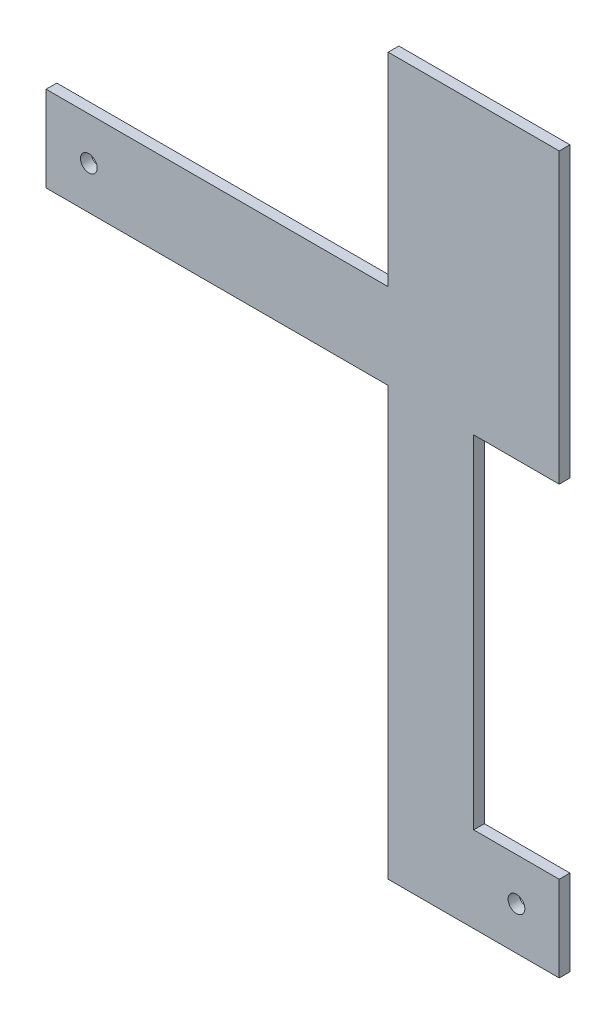
ISO-10303-21;
HEADER;
FILE_DESCRIPTION(('STEP AP214'),'2;1');
FILE_NAME('part.step','',(''),(''),'','','');
FILE_SCHEMA(('AUTOMOTIVE_DESIGN { 1 0 10303 214 1 1 1 1 }'));
ENDSEC;
DATA;
#1=APPLICATION_CONTEXT('core data for automotive mechanical design processes');
#2=APPLICATION_PROTOCOL_DEFINITION('international standard','automotive_design',2000,#1);
#3=PRODUCT_CONTEXT('',#1,'mechanical');
#4=PRODUCT('Part','Part','',(#3));
#5=PRODUCT_RELATED_PRODUCT_CATEGORY('part','',(#4));
#6=PRODUCT_DEFINITION_FORMATION('','',#4);
#7=PRODUCT_DEFINITION_CONTEXT('part definition',#1,'design');
#8=PRODUCT_DEFINITION('design','',#6,#7);
#9=PRODUCT_DEFINITION_SHAPE('','',#8);
#10=(LENGTH_UNIT() NAMED_UNIT(*) SI_UNIT(.MILLI.,.METRE.));
#11=(NAMED_UNIT(*) PLANE_ANGLE_UNIT() SI_UNIT($,.RADIAN.));
#12=(NAMED_UNIT(*) SI_UNIT($,.STERADIAN.) SOLID_ANGLE_UNIT());
#13=UNCERTAINTY_MEASURE_WITH_UNIT(LENGTH_MEASURE(1.E-05),#10,'distance_accuracy_value','');
#14=(GEOMETRIC_REPRESENTATION_CONTEXT(3) GLOBAL_UNCERTAINTY_ASSIGNED_CONTEXT((#13)) GLOBAL_UNIT_ASSIGNED_CONTEXT((#10,
#11,#12)) REPRESENTATION_CONTEXT('',''));
#15=CARTESIAN_POINT('',(0.,0.,0.));
#16=DIRECTION('',(0.,0.,1.));
#17=DIRECTION('',(1.,0.,0.));
#18=AXIS2_PLACEMENT_3D('',#15,#16,#17);
#19=CARTESIAN_POINT('',(-12.7,106.3625,3.175));
#20=DIRECTION('',(1.,0.,0.));
#21=DIRECTION('',(0.,1.,0.));
#22=AXIS2_PLACEMENT_3D('',#19,#20,#21);
#23=PLANE('',#22);
#24=DIRECTION('',(0.,-1.,0.));
#25=VECTOR('',#24,1.);
#26=CARTESIAN_POINT('',(-12.7,106.3625,0.));
#27=LINE('',#26,#25);
#28=CARTESIAN_POINT('',(-12.7,106.3625,0.));
#29=VERTEX_POINT('',#28);
#30=CARTESIAN_POINT('',(-12.7,46.0374999999999,0.));
#31=VERTEX_POINT('',#30);
#32=EDGE_CURVE('E170',#29,#31,#27,.T.);
#33=ORIENTED_EDGE('',*,*,#32,.T.);
#34=DIRECTION('',(0.,0.,-1.));
#35=VECTOR('',#34,1.);
#36=CARTESIAN_POINT('',(-12.7,46.0374999999999,3.175));
#37=LINE('',#36,#35);
#38=CARTESIAN_POINT('',(-12.7,46.0374999999999,3.175));
#39=VERTEX_POINT('',#38);
#40=EDGE_CURVE('E11',#39,#31,#37,.T.);
#41=ORIENTED_EDGE('',*,*,#40,.F.);
#42=DIRECTION('',(0.,-1.,0.));
#43=VECTOR('',#42,1.);
#44=CARTESIAN_POINT('',(-12.7,106.3625,3.175));
#45=LINE('',#44,#43);
#46=CARTESIAN_POINT('',(-12.7,106.3625,3.175));
#47=VERTEX_POINT('',#46);
#48=EDGE_CURVE('E205',#47,#39,#45,.T.);
#49=ORIENTED_EDGE('',*,*,#48,.F.);
#50=DIRECTION('',(0.,0.,-1.));
#51=VECTOR('',#50,1.);
#52=CARTESIAN_POINT('',(-12.7,106.3625,3.175));
#53=LINE('',#52,#51);
#54=EDGE_CURVE('E166',#47,#29,#53,.T.);
#55=ORIENTED_EDGE('',*,*,#54,.T.);
#56=EDGE_LOOP('',(#33,#41,#49,#55));
#57=FACE_BOUND('',#56,.T.);
#58=ADVANCED_FACE('F45',(#57),#23,.F.);
#59=CARTESIAN_POINT('',(-12.7,46.0374999999999,3.175));
#60=DIRECTION('',(0.,-1.,0.));
#61=DIRECTION('',(1.,0.,0.));
#62=AXIS2_PLACEMENT_3D('',#59,#60,#61);
#63=PLANE('',#62);
#64=DIRECTION('',(-1.,0.,0.));
#65=VECTOR('',#64,1.);
#66=CARTESIAN_POINT('',(-12.7,46.0374999999999,0.));
#67=LINE('',#66,#65);
#68=CARTESIAN_POINT('',(-114.3,46.0374999999999,0.));
#69=VERTEX_POINT('',#68);
#70=EDGE_CURVE('E174',#31,#69,#67,.T.);
#71=ORIENTED_EDGE('',*,*,#70,.T.);
#72=DIRECTION('',(0.,0.,-1.));
#73=VECTOR('',#72,1.);
#74=CARTESIAN_POINT('',(-114.3,46.0374999999999,3.175));
#75=LINE('',#74,#73);
#76=CARTESIAN_POINT('',(-114.3,46.0374999999999,3.175));
#77=VERTEX_POINT('',#76);
#78=EDGE_CURVE('E54',#77,#69,#75,.T.);
#79=ORIENTED_EDGE('',*,*,#78,.F.);
#80=DIRECTION('',(-1.,0.,0.));
#81=VECTOR('',#80,1.);
#82=CARTESIAN_POINT('',(-12.7,46.0374999999999,3.175));
#83=LINE('',#82,#81);
#84=EDGE_CURVE('E117',#39,#77,#83,.T.);
#85=ORIENTED_EDGE('',*,*,#84,.F.);
#86=ORIENTED_EDGE('',*,*,#40,.T.);
#87=EDGE_LOOP('',(#71,#79,#85,#86));
#88=FACE_BOUND('',#87,.T.);
#89=ADVANCED_FACE('F300',(#88),#63,.F.);
#90=CARTESIAN_POINT('',(-114.3,46.0374999999999,3.175));
#91=DIRECTION('',(1.,0.,0.));
#92=DIRECTION('',(0.,0.,-1.));
#93=AXIS2_PLACEMENT_3D('',#90,#91,#92);
#94=PLANE('',#93);
#95=DIRECTION('',(0.,-1.,0.));
#96=VECTOR('',#95,1.);
#97=CARTESIAN_POINT('',(-114.3,46.0374999999999,0.));
#98=LINE('',#97,#96);
#99=CARTESIAN_POINT('',(-114.3,20.6374999999999,0.));
#100=VERTEX_POINT('',#99);
#101=EDGE_CURVE('E178',#69,#100,#98,.T.);
#102=ORIENTED_EDGE('',*,*,#101,.T.);
#103=DIRECTION('',(0.,0.,-1.));
#104=VECTOR('',#103,1.);
#105=CARTESIAN_POINT('',(-114.3,20.6374999999999,3.175));
#106=LINE('',#105,#104);
#107=CARTESIAN_POINT('',(-114.3,20.6374999999999,3.175));
#108=VERTEX_POINT('',#107);
#109=EDGE_CURVE('E232',#108,#100,#106,.T.);
#110=ORIENTED_EDGE('',*,*,#109,.F.);
#111=DIRECTION('',(0.,-1.,0.));
#112=VECTOR('',#111,1.);
#113=CARTESIAN_POINT('',(-114.3,46.0374999999999,3.175));
#114=LINE('',#113,#112);
#115=EDGE_CURVE('E242',#77,#108,#114,.T.);
#116=ORIENTED_EDGE('',*,*,#115,.F.);
#117=ORIENTED_EDGE('',*,*,#78,.T.);
#118=EDGE_LOOP('',(#102,#110,#116,#117));
#119=FACE_BOUND('',#118,.T.);
#120=ADVANCED_FACE('F240',(#119),#94,.F.);
#121=CARTESIAN_POINT('',(-114.3,20.6374999999999,3.175));
#122=DIRECTION('',(0.,1.,0.));
#123=DIRECTION('',(-1.,0.,0.));
#124=AXIS2_PLACEMENT_3D('',#121,#122,#123);
#125=PLANE('',#124);
#126=DIRECTION('',(1.,0.,0.));
#127=VECTOR('',#126,1.);
#128=CARTESIAN_POINT('',(-114.3,20.6374999999999,0.));
#129=LINE('',#128,#127);
#130=CARTESIAN_POINT('',(-12.7,20.6374999999999,0.));
#131=VERTEX_POINT('',#130);
#132=EDGE_CURVE('E181',#100,#131,#129,.T.);
#133=ORIENTED_EDGE('',*,*,#132,.T.);
#134=DIRECTION('',(0.,0.,-1.));
#135=VECTOR('',#134,1.);
#136=CARTESIAN_POINT('',(-12.7,20.6374999999999,3.175));
#137=LINE('',#136,#135);
#138=CARTESIAN_POINT('',(-12.7,20.6374999999999,3.175));
#139=VERTEX_POINT('',#138);
#140=EDGE_CURVE('E228',#139,#131,#137,.T.);
#141=ORIENTED_EDGE('',*,*,#140,.F.);
#142=DIRECTION('',(1.,0.,0.));
#143=VECTOR('',#142,1.);
#144=CARTESIAN_POINT('',(-114.3,20.6374999999999,3.175));
#145=LINE('',#144,#143);
#146=EDGE_CURVE('E261',#108,#139,#145,.T.);
#147=ORIENTED_EDGE('',*,*,#146,.F.);
#148=ORIENTED_EDGE('',*,*,#109,.T.);
#149=EDGE_LOOP('',(#133,#141,#147,#148));
#150=FACE_BOUND('',#149,.T.);
#151=ADVANCED_FACE('F251',(#150),#125,.F.);
#152=CARTESIAN_POINT('',(-12.7,20.6374999999999,3.175));
#153=DIRECTION('',(1.,0.,0.));
#154=DIRECTION('',(0.,1.,0.));
#155=AXIS2_PLACEMENT_3D('',#152,#153,#154);
#156=PLANE('',#155);
#157=DIRECTION('',(0.,-1.,0.));
#158=VECTOR('',#157,1.);
#159=CARTESIAN_POINT('',(-12.7,20.6374999999999,0.));
#160=LINE('',#159,#158);
#161=CARTESIAN_POINT('',(-12.7,-106.3625,0.));
#162=VERTEX_POINT('',#161);
#163=EDGE_CURVE('E184',#131,#162,#160,.T.);
#164=ORIENTED_EDGE('',*,*,#163,.T.);
#165=DIRECTION('',(0.,0.,-1.));
#166=VECTOR('',#165,1.);
#167=CARTESIAN_POINT('',(-12.7,-106.3625,3.175));
#168=LINE('',#167,#166);
#169=CARTESIAN_POINT('',(-12.7,-106.3625,3.175));
#170=VERTEX_POINT('',#169);
#171=EDGE_CURVE('E224',#170,#162,#168,.T.);
#172=ORIENTED_EDGE('',*,*,#171,.F.);
#173=DIRECTION('',(0.,-1.,0.));
#174=VECTOR('',#173,1.);
#175=CARTESIAN_POINT('',(-12.7,20.6374999999999,3.175));
#176=LINE('',#175,#174);
#177=EDGE_CURVE('E257',#139,#170,#176,.T.);
#178=ORIENTED_EDGE('',*,*,#177,.F.);
#179=ORIENTED_EDGE('',*,*,#140,.T.);
#180=EDGE_LOOP('',(#164,#172,#178,#179));
#181=FACE_BOUND('',#180,.T.);
#182=ADVANCED_FACE('F255',(#181),#156,.F.);
#183=CARTESIAN_POINT('',(38.1,-106.3625,3.175));
#184=DIRECTION('',(0.,1.,0.));
#185=DIRECTION('',(0.,0.,1.));
#186=AXIS2_PLACEMENT_3D('',#183,#184,#185);
#187=PLANE('',#186);
#188=DIRECTION('',(1.,0.,0.));
#189=VECTOR('',#188,1.);
#190=CARTESIAN_POINT('',(38.1,-106.3625,0.));
#191=LINE('',#190,#189);
#192=CARTESIAN_POINT('',(38.1,-106.3625,0.));
#193=VERTEX_POINT('',#192);
#194=EDGE_CURVE('E187',#162,#193,#191,.T.);
#195=ORIENTED_EDGE('',*,*,#194,.T.);
#196=DIRECTION('',(0.,0.,-1.));
#197=VECTOR('',#196,1.);
#198=CARTESIAN_POINT('',(38.1,-106.3625,3.175));
#199=LINE('',#198,#197);
#200=CARTESIAN_POINT('',(38.1,-106.3625,3.175));
#201=VERTEX_POINT('',#200);
#202=EDGE_CURVE('E220',#201,#193,#199,.T.);
#203=ORIENTED_EDGE('',*,*,#202,.F.);
#204=DIRECTION('',(1.,0.,0.));
#205=VECTOR('',#204,1.);
#206=CARTESIAN_POINT('',(38.1,-106.3625,3.175));
#207=LINE('',#206,#205);
#208=EDGE_CURVE('E260',#170,#201,#207,.T.);
#209=ORIENTED_EDGE('',*,*,#208,.F.);
#210=ORIENTED_EDGE('',*,*,#171,.T.);
#211=EDGE_LOOP('',(#195,#203,#209,#210));
#212=FACE_BOUND('',#211,.T.);
#213=ADVANCED_FACE('F313',(#212),#187,.F.);
#214=CARTESIAN_POINT('',(38.1,-80.9625000000001,3.175));
#215=DIRECTION('',(-1.,0.,0.));
#216=DIRECTION('',(0.,0.,1.));
#217=AXIS2_PLACEMENT_3D('',#214,#215,#216);
#218=PLANE('',#217);
#219=DIRECTION('',(0.,1.,0.));
#220=VECTOR('',#219,1.);
#221=CARTESIAN_POINT('',(38.1,-80.9625000000001,0.));
#222=LINE('',#221,#220);
#223=CARTESIAN_POINT('',(38.1,-80.9625000000001,0.));
#224=VERTEX_POINT('',#223);
#225=EDGE_CURVE('E190',#193,#224,#222,.T.);
#226=ORIENTED_EDGE('',*,*,#225,.T.);
#227=DIRECTION('',(0.,0.,-1.));
#228=VECTOR('',#227,1.);
#229=CARTESIAN_POINT('',(38.1,-80.9625000000001,3.175));
#230=LINE('',#229,#228);
#231=CARTESIAN_POINT('',(38.1,-80.9625000000001,3.175));
#232=VERTEX_POINT('',#231);
#233=EDGE_CURVE('E216',#232,#224,#230,.T.);
#234=ORIENTED_EDGE('',*,*,#233,.F.);
#235=DIRECTION('',(0.,1.,0.));
#236=VECTOR('',#235,1.);
#237=CARTESIAN_POINT('',(38.1,-80.9625000000001,3.175));
#238=LINE('',#237,#236);
#239=EDGE_CURVE('E265',#201,#232,#238,.T.);
#240=ORIENTED_EDGE('',*,*,#239,.F.);
#241=ORIENTED_EDGE('',*,*,#202,.T.);
#242=EDGE_LOOP('',(#226,#234,#240,#241));
#243=FACE_BOUND('',#242,.T.);
#244=ADVANCED_FACE('F316',(#243),#218,.F.);
#245=CARTESIAN_POINT('',(12.7,-80.9625000000001,3.175));
#246=DIRECTION('',(0.,-1.,0.));
#247=DIRECTION('',(0.,0.,-1.));
#248=AXIS2_PLACEMENT_3D('',#245,#246,#247);
#249=PLANE('',#248);
#250=DIRECTION('',(-1.,0.,0.));
#251=VECTOR('',#250,1.);
#252=CARTESIAN_POINT('',(12.7,-80.9625000000001,0.));
#253=LINE('',#252,#251);
#254=CARTESIAN_POINT('',(12.7,-80.9625000000001,0.));
#255=VERTEX_POINT('',#254);
#256=EDGE_CURVE('E193',#224,#255,#253,.T.);
#257=ORIENTED_EDGE('',*,*,#256,.T.);
#258=DIRECTION('',(0.,0.,-1.));
#259=VECTOR('',#258,1.);
#260=CARTESIAN_POINT('',(12.7,-80.9625000000001,3.175));
#261=LINE('',#260,#259);
#262=CARTESIAN_POINT('',(12.7,-80.9625000000001,3.175));
#263=VERTEX_POINT('',#262);
#264=EDGE_CURVE('E212',#263,#255,#261,.T.);
#265=ORIENTED_EDGE('',*,*,#264,.F.);
#266=DIRECTION('',(-1.,0.,0.));
#267=VECTOR('',#266,1.);
#268=CARTESIAN_POINT('',(12.7,-80.9625000000001,3.175));
#269=LINE('',#268,#267);
#270=EDGE_CURVE('E272',#232,#263,#269,.T.);
#271=ORIENTED_EDGE('',*,*,#270,.F.);
#272=ORIENTED_EDGE('',*,*,#233,.T.);
#273=EDGE_LOOP('',(#257,#265,#271,#272));
#274=FACE_BOUND('',#273,.T.);
#275=ADVANCED_FACE('F280',(#274),#249,.F.);
#276=CARTESIAN_POINT('',(12.7,-80.9625000000001,3.175));
#277=DIRECTION('',(-1.,0.,0.));
#278=DIRECTION('',(0.,-1.,0.));
#279=AXIS2_PLACEMENT_3D('',#276,#277,#278);
#280=PLANE('',#279);
#281=DIRECTION('',(0.,1.,0.));
#282=VECTOR('',#281,1.);
#283=CARTESIAN_POINT('',(12.7,-80.9625000000001,0.));
#284=LINE('',#283,#282);
#285=CARTESIAN_POINT('',(12.7,20.6374999999999,0.));
#286=VERTEX_POINT('',#285);
#287=EDGE_CURVE('E196',#255,#286,#284,.T.);
#288=ORIENTED_EDGE('',*,*,#287,.T.);
#289=DIRECTION('',(0.,0.,-1.));
#290=VECTOR('',#289,1.);
#291=CARTESIAN_POINT('',(12.7,20.6374999999999,3.175));
#292=LINE('',#291,#290);
#293=CARTESIAN_POINT('',(12.7,20.6374999999999,3.175));
#294=VERTEX_POINT('',#293);
#295=EDGE_CURVE('E159',#294,#286,#292,.T.);
#296=ORIENTED_EDGE('',*,*,#295,.F.);
#297=DIRECTION('',(0.,1.,0.));
#298=VECTOR('',#297,1.);
#299=CARTESIAN_POINT('',(12.7,-80.9625000000001,3.175));
#300=LINE('',#299,#298);
#301=EDGE_CURVE('E148',#263,#294,#300,.T.);
#302=ORIENTED_EDGE('',*,*,#301,.F.);
#303=ORIENTED_EDGE('',*,*,#264,.T.);
#304=EDGE_LOOP('',(#288,#296,#302,#303));
#305=FACE_BOUND('',#304,.T.);
#306=ADVANCED_FACE('F284',(#305),#280,.F.);
#307=CARTESIAN_POINT('',(12.7,20.6374999999999,3.175));
#308=DIRECTION('',(0.,1.,0.));
#309=DIRECTION('',(-1.,0.,0.));
#310=AXIS2_PLACEMENT_3D('',#307,#308,#309);
#311=PLANE('',#310);
#312=DIRECTION('',(1.,0.,0.));
#313=VECTOR('',#312,1.);
#314=CARTESIAN_POINT('',(12.7,20.6374999999999,0.));
#315=LINE('',#314,#313);
#316=CARTESIAN_POINT('',(38.1,20.6374999999999,0.));
#317=VERTEX_POINT('',#316);
#318=EDGE_CURVE('E157',#286,#317,#315,.T.);
#319=ORIENTED_EDGE('',*,*,#318,.T.);
#320=DIRECTION('',(0.,0.,-1.));
#321=VECTOR('',#320,1.);
#322=CARTESIAN_POINT('',(38.1,20.6374999999999,3.175));
#323=LINE('',#322,#321);
#324=CARTESIAN_POINT('',(38.1,20.6374999999999,3.175));
#325=VERTEX_POINT('',#324);
#326=EDGE_CURVE('E154',#325,#317,#323,.T.);
#327=ORIENTED_EDGE('',*,*,#326,.F.);
#328=DIRECTION('',(1.,0.,0.));
#329=VECTOR('',#328,1.);
#330=CARTESIAN_POINT('',(12.7,20.6374999999999,3.175));
#331=LINE('',#330,#329);
#332=EDGE_CURVE('E142',#294,#325,#331,.T.);
#333=ORIENTED_EDGE('',*,*,#332,.F.);
#334=ORIENTED_EDGE('',*,*,#295,.T.);
#335=EDGE_LOOP('',(#319,#327,#333,#334));
#336=FACE_BOUND('',#335,.T.);
#337=ADVANCED_FACE('F155',(#336),#311,.F.);
#338=CARTESIAN_POINT('',(38.1,20.6374999999999,3.175));
#339=DIRECTION('',(-1.,0.,0.));
#340=DIRECTION('',(0.,-1.,0.));
#341=AXIS2_PLACEMENT_3D('',#338,#339,#340);
#342=PLANE('',#341);
#343=DIRECTION('',(0.,1.,0.));
#344=VECTOR('',#343,1.);
#345=CARTESIAN_POINT('',(38.1,20.6374999999999,0.));
#346=LINE('',#345,#344);
#347=CARTESIAN_POINT('',(38.1,106.3625,0.));
#348=VERTEX_POINT('',#347);
#349=EDGE_CURVE('E103',#317,#348,#346,.T.);
#350=ORIENTED_EDGE('',*,*,#349,.T.);
#351=DIRECTION('',(0.,0.,-1.));
#352=VECTOR('',#351,1.);
#353=CARTESIAN_POINT('',(38.1,106.3625,3.175));
#354=LINE('',#353,#352);
#355=CARTESIAN_POINT('',(38.1,106.3625,3.175));
#356=VERTEX_POINT('',#355);
#357=EDGE_CURVE('E160',#356,#348,#354,.T.);
#358=ORIENTED_EDGE('',*,*,#357,.F.);
#359=DIRECTION('',(0.,1.,0.));
#360=VECTOR('',#359,1.);
#361=CARTESIAN_POINT('',(38.1,20.6374999999999,3.175));
#362=LINE('',#361,#360);
#363=EDGE_CURVE('E146',#325,#356,#362,.T.);
#364=ORIENTED_EDGE('',*,*,#363,.F.);
#365=ORIENTED_EDGE('',*,*,#326,.T.);
#366=EDGE_LOOP('',(#350,#358,#364,#365));
#367=FACE_BOUND('',#366,.T.);
#368=ADVANCED_FACE('F162',(#367),#342,.F.);
#369=CARTESIAN_POINT('',(38.1,106.3625,3.175));
#370=DIRECTION('',(0.,-1.,0.));
#371=DIRECTION('',(0.,0.,-1.));
#372=AXIS2_PLACEMENT_3D('',#369,#370,#371);
#373=PLANE('',#372);
#374=DIRECTION('',(-1.,0.,0.));
#375=VECTOR('',#374,1.);
#376=CARTESIAN_POINT('',(38.1,106.3625,0.));
#377=LINE('',#376,#375);
#378=EDGE_CURVE('E109',#348,#29,#377,.T.);
#379=ORIENTED_EDGE('',*,*,#378,.T.);
#380=ORIENTED_EDGE('',*,*,#54,.F.);
#381=DIRECTION('',(-1.,0.,0.));
#382=VECTOR('',#381,1.);
#383=CARTESIAN_POINT('',(38.1,106.3625,3.175));
#384=LINE('',#383,#382);
#385=EDGE_CURVE('E62',#356,#47,#384,.T.);
#386=ORIENTED_EDGE('',*,*,#385,.F.);
#387=ORIENTED_EDGE('',*,*,#357,.T.);
#388=EDGE_LOOP('',(#379,#380,#386,#387));
#389=FACE_BOUND('',#388,.T.);
#390=ADVANCED_FACE('F288',(#389),#373,.F.);
#391=CARTESIAN_POINT('',(0.,0.,3.175));
#392=DIRECTION('',(0.,0.,-1.));
#393=DIRECTION('',(-1.,0.,0.));
#394=AXIS2_PLACEMENT_3D('',#391,#392,#393);
#395=PLANE('',#394);
#396=CARTESIAN_POINT('',(25.4,-93.6625000000001,3.175));
#397=DIRECTION('',(0.,0.,1.));
#398=DIRECTION('',(1.,0.,0.));
#399=AXIS2_PLACEMENT_3D('',#396,#397,#398);
#400=CIRCLE('',#399,2.48919999999999);
#401=CARTESIAN_POINT('',(27.8892,-93.6625000000001,3.175));
#402=VERTEX_POINT('',#401);
#403=EDGE_CURVE('E383',#402,#402,#400,.T.);
#404=ORIENTED_EDGE('',*,*,#403,.F.);
#405=EDGE_LOOP('',(#404));
#406=FACE_BOUND('',#405,.T.);
#407=CARTESIAN_POINT('',(-101.6,33.3374999999999,3.175));
#408=DIRECTION('',(0.,0.,1.));
#409=DIRECTION('',(1.,0.,0.));
#410=AXIS2_PLACEMENT_3D('',#407,#408,#409);
#411=CIRCLE('',#410,2.48919999999998);
#412=CARTESIAN_POINT('',(-99.1108,33.3374999999999,3.175));
#413=VERTEX_POINT('',#412);
#414=EDGE_CURVE('E387',#413,#413,#411,.T.);
#415=ORIENTED_EDGE('',*,*,#414,.F.);
#416=EDGE_LOOP('',(#415));
#417=FACE_BOUND('',#416,.T.);
#418=ORIENTED_EDGE('',*,*,#48,.T.);
#419=ORIENTED_EDGE('',*,*,#84,.T.);
#420=ORIENTED_EDGE('',*,*,#115,.T.);
#421=ORIENTED_EDGE('',*,*,#146,.T.);
#422=ORIENTED_EDGE('',*,*,#177,.T.);
#423=ORIENTED_EDGE('',*,*,#208,.T.);
#424=ORIENTED_EDGE('',*,*,#239,.T.);
#425=ORIENTED_EDGE('',*,*,#270,.T.);
#426=ORIENTED_EDGE('',*,*,#301,.T.);
#427=ORIENTED_EDGE('',*,*,#332,.T.);
#428=ORIENTED_EDGE('',*,*,#363,.T.);
#429=ORIENTED_EDGE('',*,*,#385,.T.);
#430=EDGE_LOOP('',(#418,#419,#420,#421,#422,#423,#424,#425,#426,#427,#428,#429));
#431=FACE_BOUND('',#430,.T.);
#432=ADVANCED_FACE('F144',(#406,#417,#431),#395,.F.);
#433=CARTESIAN_POINT('',(0.,0.,0.));
#434=DIRECTION('',(0.,0.,-1.));
#435=DIRECTION('',(-1.,0.,0.));
#436=AXIS2_PLACEMENT_3D('',#433,#434,#435);
#437=PLANE('',#436);
#438=CARTESIAN_POINT('',(25.4,-93.6625000000001,0.));
#439=DIRECTION('',(0.,0.,1.));
#440=DIRECTION('',(1.,0.,0.));
#441=AXIS2_PLACEMENT_3D('',#438,#439,#440);
#442=CIRCLE('',#441,2.4892);
#443=CARTESIAN_POINT('',(27.8892,-93.6625000000001,0.));
#444=VERTEX_POINT('',#443);
#445=EDGE_CURVE('E380',#444,#444,#442,.T.);
#446=ORIENTED_EDGE('',*,*,#445,.T.);
#447=EDGE_LOOP('',(#446));
#448=FACE_BOUND('',#447,.T.);
#449=CARTESIAN_POINT('',(-101.6,33.3374999999999,0.));
#450=DIRECTION('',(0.,0.,1.));
#451=DIRECTION('',(1.,0.,0.));
#452=AXIS2_PLACEMENT_3D('',#449,#450,#451);
#453=CIRCLE('',#452,2.4892);
#454=CARTESIAN_POINT('',(-99.1108,33.3374999999999,0.));
#455=VERTEX_POINT('',#454);
#456=EDGE_CURVE('E175',#455,#455,#453,.T.);
#457=ORIENTED_EDGE('',*,*,#456,.T.);
#458=EDGE_LOOP('',(#457));
#459=FACE_BOUND('',#458,.T.);
#460=ORIENTED_EDGE('',*,*,#32,.F.);
#461=ORIENTED_EDGE('',*,*,#378,.F.);
#462=ORIENTED_EDGE('',*,*,#349,.F.);
#463=ORIENTED_EDGE('',*,*,#318,.F.);
#464=ORIENTED_EDGE('',*,*,#287,.F.);
#465=ORIENTED_EDGE('',*,*,#256,.F.);
#466=ORIENTED_EDGE('',*,*,#225,.F.);
#467=ORIENTED_EDGE('',*,*,#194,.F.);
#468=ORIENTED_EDGE('',*,*,#163,.F.);
#469=ORIENTED_EDGE('',*,*,#132,.F.);
#470=ORIENTED_EDGE('',*,*,#101,.F.);
#471=ORIENTED_EDGE('',*,*,#70,.F.);
#472=EDGE_LOOP('',(#460,#461,#462,#463,#464,#465,#466,#467,#468,#469,#470,#471));
#473=FACE_BOUND('',#472,.T.);
#474=ADVANCED_FACE('F246',(#448,#459,#473),#437,.T.);
#475=CARTESIAN_POINT('',(-101.6,33.3374999999999,3.175));
#476=DIRECTION('',(0.,0.,1.));
#477=DIRECTION('',(1.,0.,0.));
#478=AXIS2_PLACEMENT_3D('',#475,#476,#477);
#479=CYLINDRICAL_SURFACE('',#478,2.48919999999999);
#480=ORIENTED_EDGE('',*,*,#456,.F.);
#481=EDGE_LOOP('',(#480));
#482=FACE_BOUND('',#481,.T.);
#483=ORIENTED_EDGE('',*,*,#414,.T.);
#484=EDGE_LOOP('',(#483));
#485=FACE_BOUND('',#484,.T.);
#486=ADVANCED_FACE('F355',(#482,#485),#479,.F.);
#487=CARTESIAN_POINT('',(25.4,-93.6625000000001,3.175));
#488=DIRECTION('',(0.,0.,1.));
#489=DIRECTION('',(1.,0.,0.));
#490=AXIS2_PLACEMENT_3D('',#487,#488,#489);
#491=CYLINDRICAL_SURFACE('',#490,2.48919999999999);
#492=ORIENTED_EDGE('',*,*,#445,.F.);
#493=EDGE_LOOP('',(#492));
#494=FACE_BOUND('',#493,.T.);
#495=ORIENTED_EDGE('',*,*,#403,.T.);
#496=EDGE_LOOP('',(#495));
#497=FACE_BOUND('',#496,.T.);
#498=ADVANCED_FACE('F364',(#494,#497),#491,.F.);
#499=CLOSED_SHELL('',(#58,#89,#120,#151,#182,#213,#244,#275,#306,#337,#368,#390,#432,#474,#486,#498));
#500=MANIFOLD_SOLID_BREP('B2',#499);
#501=ADVANCED_BREP_SHAPE_REPRESENTATION('',(#18,#500),#14);
#502=SHAPE_DEFINITION_REPRESENTATION(#9,#501);
ENDSEC;
END-ISO-10303-21;
